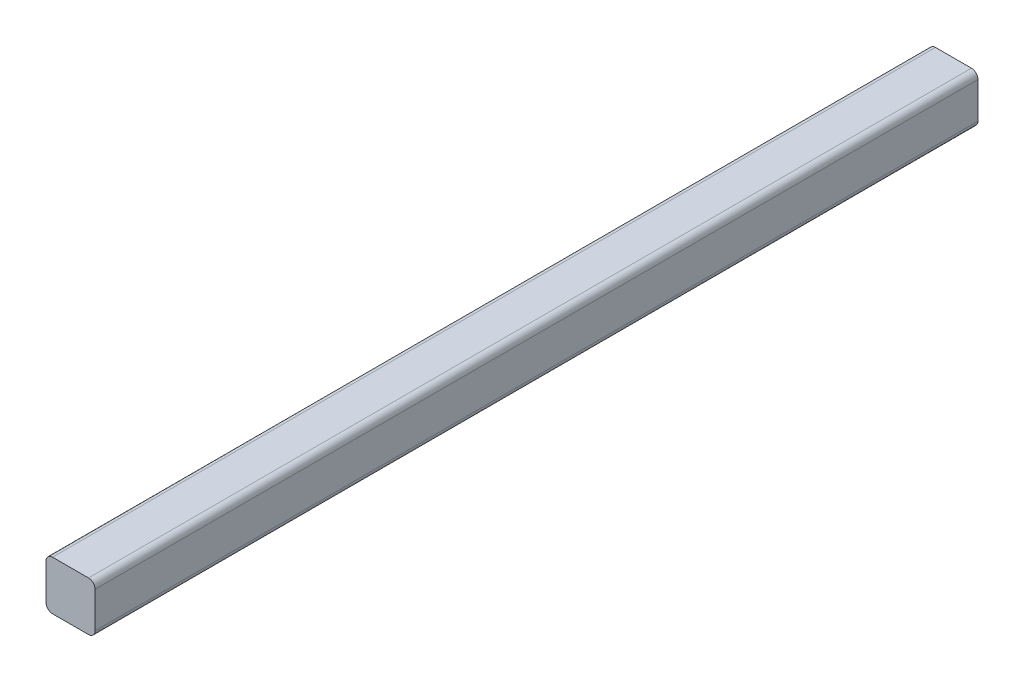
ISO-10303-21;
HEADER;
FILE_DESCRIPTION(('STEP AP214'),'2;1');
FILE_NAME('part.step','',(''),(''),'','','');
FILE_SCHEMA(('AUTOMOTIVE_DESIGN { 1 0 10303 214 1 1 1 1 }'));
ENDSEC;
DATA;
#1=APPLICATION_CONTEXT('core data for automotive mechanical design processes');
#2=APPLICATION_PROTOCOL_DEFINITION('international standard','automotive_design',2000,#1);
#3=PRODUCT_CONTEXT('',#1,'mechanical');
#4=PRODUCT('Part','Part','',(#3));
#5=PRODUCT_RELATED_PRODUCT_CATEGORY('part','',(#4));
#6=PRODUCT_DEFINITION_FORMATION('','',#4);
#7=PRODUCT_DEFINITION_CONTEXT('part definition',#1,'design');
#8=PRODUCT_DEFINITION('design','',#6,#7);
#9=PRODUCT_DEFINITION_SHAPE('','',#8);
#10=(LENGTH_UNIT() NAMED_UNIT(*) SI_UNIT(.MILLI.,.METRE.));
#11=(NAMED_UNIT(*) PLANE_ANGLE_UNIT() SI_UNIT($,.RADIAN.));
#12=(NAMED_UNIT(*) SI_UNIT($,.STERADIAN.) SOLID_ANGLE_UNIT());
#13=UNCERTAINTY_MEASURE_WITH_UNIT(LENGTH_MEASURE(1.E-05),#10,'distance_accuracy_value','');
#14=(GEOMETRIC_REPRESENTATION_CONTEXT(3) GLOBAL_UNCERTAINTY_ASSIGNED_CONTEXT((#13)) GLOBAL_UNIT_ASSIGNED_CONTEXT((#10,
#11,#12)) REPRESENTATION_CONTEXT('',''));
#15=CARTESIAN_POINT('',(0.,0.,0.));
#16=DIRECTION('',(0.,0.,1.));
#17=DIRECTION('',(1.,0.,0.));
#18=AXIS2_PLACEMENT_3D('',#15,#16,#17);
#19=CARTESIAN_POINT('',(9.525,-9.525,171.45));
#20=DIRECTION('',(-1.,0.,0.));
#21=DIRECTION('',(0.,0.,1.));
#22=AXIS2_PLACEMENT_3D('',#19,#20,#21);
#23=PLANE('',#22);
#24=DIRECTION('',(0.,1.,0.));
#25=VECTOR('',#24,1.);
#26=CARTESIAN_POINT('',(9.525,-9.525,-171.45));
#27=LINE('',#26,#25);
#28=CARTESIAN_POINT('',(9.525,-6.985,-171.45));
#29=VERTEX_POINT('',#28);
#30=CARTESIAN_POINT('',(9.525,6.98499999999999,-171.45));
#31=VERTEX_POINT('',#30);
#32=EDGE_CURVE('E126',#29,#31,#27,.T.);
#33=ORIENTED_EDGE('',*,*,#32,.T.);
#34=DIRECTION('',(0.,0.,-1.));
#35=VECTOR('',#34,1.);
#36=CARTESIAN_POINT('',(9.525,6.985,171.45));
#37=LINE('',#36,#35);
#38=CARTESIAN_POINT('',(9.525,6.98499999999999,171.45));
#39=VERTEX_POINT('',#38);
#40=EDGE_CURVE('E104',#31,#39,#37,.F.);
#41=ORIENTED_EDGE('',*,*,#40,.T.);
#42=DIRECTION('',(0.,1.,0.));
#43=VECTOR('',#42,1.);
#44=CARTESIAN_POINT('',(9.525,-9.525,171.45));
#45=LINE('',#44,#43);
#46=CARTESIAN_POINT('',(9.525,-6.985,171.45));
#47=VERTEX_POINT('',#46);
#48=EDGE_CURVE('E135',#47,#39,#45,.T.);
#49=ORIENTED_EDGE('',*,*,#48,.F.);
#50=DIRECTION('',(0.,0.,-1.));
#51=VECTOR('',#50,1.);
#52=CARTESIAN_POINT('',(9.525,-6.985,171.45));
#53=LINE('',#52,#51);
#54=EDGE_CURVE('E109',#47,#29,#53,.T.);
#55=ORIENTED_EDGE('',*,*,#54,.T.);
#56=EDGE_LOOP('',(#33,#41,#49,#55));
#57=FACE_BOUND('',#56,.T.);
#58=ADVANCED_FACE('F33',(#57),#23,.F.);
#59=CARTESIAN_POINT('',(-9.525,9.525,171.45));
#60=DIRECTION('',(0.,-1.,0.));
#61=DIRECTION('',(0.,0.,-1.));
#62=AXIS2_PLACEMENT_3D('',#59,#60,#61);
#63=PLANE('',#62);
#64=DIRECTION('',(-1.,0.,0.));
#65=VECTOR('',#64,1.);
#66=CARTESIAN_POINT('',(-9.525,9.525,171.45));
#67=LINE('',#66,#65);
#68=CARTESIAN_POINT('',(6.98499999999999,9.525,171.45));
#69=VERTEX_POINT('',#68);
#70=CARTESIAN_POINT('',(-6.985,9.525,171.45));
#71=VERTEX_POINT('',#70);
#72=EDGE_CURVE('E119',#69,#71,#67,.T.);
#73=ORIENTED_EDGE('',*,*,#72,.F.);
#74=DIRECTION('',(0.,0.,-1.));
#75=VECTOR('',#74,1.);
#76=CARTESIAN_POINT('',(6.985,9.525,171.45));
#77=LINE('',#76,#75);
#78=CARTESIAN_POINT('',(6.98499999999999,9.525,-171.45));
#79=VERTEX_POINT('',#78);
#80=EDGE_CURVE('E103',#69,#79,#77,.T.);
#81=ORIENTED_EDGE('',*,*,#80,.T.);
#82=DIRECTION('',(-1.,0.,0.));
#83=VECTOR('',#82,1.);
#84=CARTESIAN_POINT('',(-9.525,9.525,-171.45));
#85=LINE('',#84,#83);
#86=CARTESIAN_POINT('',(-6.985,9.525,-171.45));
#87=VERTEX_POINT('',#86);
#88=EDGE_CURVE('E116',#79,#87,#85,.T.);
#89=ORIENTED_EDGE('',*,*,#88,.T.);
#90=DIRECTION('',(0.,0.,-1.));
#91=VECTOR('',#90,1.);
#92=CARTESIAN_POINT('',(-6.985,9.525,171.45));
#93=LINE('',#92,#91);
#94=EDGE_CURVE('E121',#87,#71,#93,.F.);
#95=ORIENTED_EDGE('',*,*,#94,.T.);
#96=EDGE_LOOP('',(#73,#81,#89,#95));
#97=FACE_BOUND('',#96,.T.);
#98=ADVANCED_FACE('F115',(#97),#63,.F.);
#99=CARTESIAN_POINT('',(-9.525,-9.525,171.45));
#100=DIRECTION('',(1.,0.,0.));
#101=DIRECTION('',(0.,0.,-1.));
#102=AXIS2_PLACEMENT_3D('',#99,#100,#101);
#103=PLANE('',#102);
#104=DIRECTION('',(0.,-1.,0.));
#105=VECTOR('',#104,1.);
#106=CARTESIAN_POINT('',(-9.525,-9.525,171.45));
#107=LINE('',#106,#105);
#108=CARTESIAN_POINT('',(-9.525,6.98499999999999,171.45));
#109=VERTEX_POINT('',#108);
#110=CARTESIAN_POINT('',(-9.525,-6.985,171.45));
#111=VERTEX_POINT('',#110);
#112=EDGE_CURVE('E161',#109,#111,#107,.T.);
#113=ORIENTED_EDGE('',*,*,#112,.F.);
#114=DIRECTION('',(0.,0.,-1.));
#115=VECTOR('',#114,1.);
#116=CARTESIAN_POINT('',(-9.525,6.985,171.45));
#117=LINE('',#116,#115);
#118=CARTESIAN_POINT('',(-9.525,6.98499999999999,-171.45));
#119=VERTEX_POINT('',#118);
#120=EDGE_CURVE('E154',#109,#119,#117,.T.);
#121=ORIENTED_EDGE('',*,*,#120,.T.);
#122=DIRECTION('',(0.,-1.,0.));
#123=VECTOR('',#122,1.);
#124=CARTESIAN_POINT('',(-9.525,-9.525,-171.45));
#125=LINE('',#124,#123);
#126=CARTESIAN_POINT('',(-9.525,-6.985,-171.45));
#127=VERTEX_POINT('',#126);
#128=EDGE_CURVE('E125',#119,#127,#125,.T.);
#129=ORIENTED_EDGE('',*,*,#128,.T.);
#130=DIRECTION('',(0.,0.,-1.));
#131=VECTOR('',#130,1.);
#132=CARTESIAN_POINT('',(-9.525,-6.985,171.45));
#133=LINE('',#132,#131);
#134=EDGE_CURVE('E152',#127,#111,#133,.F.);
#135=ORIENTED_EDGE('',*,*,#134,.T.);
#136=EDGE_LOOP('',(#113,#121,#129,#135));
#137=FACE_BOUND('',#136,.T.);
#138=ADVANCED_FACE('F159',(#137),#103,.F.);
#139=CARTESIAN_POINT('',(-9.525,-9.525,171.45));
#140=DIRECTION('',(0.,1.,0.));
#141=DIRECTION('',(0.,0.,1.));
#142=AXIS2_PLACEMENT_3D('',#139,#140,#141);
#143=PLANE('',#142);
#144=DIRECTION('',(1.,0.,0.));
#145=VECTOR('',#144,1.);
#146=CARTESIAN_POINT('',(-9.525,-9.525,171.45));
#147=LINE('',#146,#145);
#148=CARTESIAN_POINT('',(-6.985,-9.525,171.45));
#149=VERTEX_POINT('',#148);
#150=CARTESIAN_POINT('',(6.98499999999999,-9.525,171.45));
#151=VERTEX_POINT('',#150);
#152=EDGE_CURVE('E136',#149,#151,#147,.T.);
#153=ORIENTED_EDGE('',*,*,#152,.F.);
#154=DIRECTION('',(0.,0.,-1.));
#155=VECTOR('',#154,1.);
#156=CARTESIAN_POINT('',(-6.985,-9.525,171.45));
#157=LINE('',#156,#155);
#158=CARTESIAN_POINT('',(-6.985,-9.525,-171.45));
#159=VERTEX_POINT('',#158);
#160=EDGE_CURVE('E11',#149,#159,#157,.T.);
#161=ORIENTED_EDGE('',*,*,#160,.T.);
#162=DIRECTION('',(1.,0.,0.));
#163=VECTOR('',#162,1.);
#164=CARTESIAN_POINT('',(-9.525,-9.525,-171.45));
#165=LINE('',#164,#163);
#166=CARTESIAN_POINT('',(6.98499999999999,-9.525,-171.45));
#167=VERTEX_POINT('',#166);
#168=EDGE_CURVE('E129',#159,#167,#165,.T.);
#169=ORIENTED_EDGE('',*,*,#168,.T.);
#170=DIRECTION('',(0.,0.,-1.));
#171=VECTOR('',#170,1.);
#172=CARTESIAN_POINT('',(6.985,-9.525,171.45));
#173=LINE('',#172,#171);
#174=EDGE_CURVE('E41',#167,#151,#173,.F.);
#175=ORIENTED_EDGE('',*,*,#174,.T.);
#176=EDGE_LOOP('',(#153,#161,#169,#175));
#177=FACE_BOUND('',#176,.T.);
#178=ADVANCED_FACE('F168',(#177),#143,.F.);
#179=CARTESIAN_POINT('',(0.,0.,171.45));
#180=DIRECTION('',(0.,0.,-1.));
#181=DIRECTION('',(-1.,0.,0.));
#182=AXIS2_PLACEMENT_3D('',#179,#180,#181);
#183=PLANE('',#182);
#184=ORIENTED_EDGE('',*,*,#48,.T.);
#185=CARTESIAN_POINT('',(6.985,6.985,171.45));
#186=DIRECTION('',(0.,0.,-1.));
#187=DIRECTION('',(-1.,0.,0.));
#188=AXIS2_PLACEMENT_3D('',#185,#186,#187);
#189=CIRCLE('',#188,2.54);
#190=EDGE_CURVE('E150',#39,#69,#189,.F.);
#191=ORIENTED_EDGE('',*,*,#190,.T.);
#192=ORIENTED_EDGE('',*,*,#72,.T.);
#193=CARTESIAN_POINT('',(-6.985,6.985,171.45));
#194=DIRECTION('',(0.,0.,-1.));
#195=DIRECTION('',(-1.,0.,0.));
#196=AXIS2_PLACEMENT_3D('',#193,#194,#195);
#197=CIRCLE('',#196,2.54);
#198=EDGE_CURVE('E148',#71,#109,#197,.F.);
#199=ORIENTED_EDGE('',*,*,#198,.T.);
#200=ORIENTED_EDGE('',*,*,#112,.T.);
#201=CARTESIAN_POINT('',(-6.985,-6.985,171.45));
#202=DIRECTION('',(0.,0.,-1.));
#203=DIRECTION('',(-1.,0.,0.));
#204=AXIS2_PLACEMENT_3D('',#201,#202,#203);
#205=CIRCLE('',#204,2.54);
#206=EDGE_CURVE('E54',#111,#149,#205,.F.);
#207=ORIENTED_EDGE('',*,*,#206,.T.);
#208=ORIENTED_EDGE('',*,*,#152,.T.);
#209=CARTESIAN_POINT('',(6.985,-6.985,171.45));
#210=DIRECTION('',(0.,0.,-1.));
#211=DIRECTION('',(-1.,0.,0.));
#212=AXIS2_PLACEMENT_3D('',#209,#210,#211);
#213=CIRCLE('',#212,2.54);
#214=EDGE_CURVE('E145',#151,#47,#213,.F.);
#215=ORIENTED_EDGE('',*,*,#214,.T.);
#216=EDGE_LOOP('',(#184,#191,#192,#199,#200,#207,#208,#215));
#217=FACE_BOUND('',#216,.T.);
#218=ADVANCED_FACE('F175',(#217),#183,.F.);
#219=CARTESIAN_POINT('',(0.,0.,-171.45));
#220=DIRECTION('',(0.,0.,-1.));
#221=DIRECTION('',(-1.,0.,0.));
#222=AXIS2_PLACEMENT_3D('',#219,#220,#221);
#223=PLANE('',#222);
#224=ORIENTED_EDGE('',*,*,#88,.F.);
#225=CARTESIAN_POINT('',(6.985,6.985,-171.45));
#226=DIRECTION('',(0.,0.,-1.));
#227=DIRECTION('',(-1.,0.,0.));
#228=AXIS2_PLACEMENT_3D('',#225,#226,#227);
#229=CIRCLE('',#228,2.54);
#230=EDGE_CURVE('E99',#79,#31,#229,.T.);
#231=ORIENTED_EDGE('',*,*,#230,.T.);
#232=ORIENTED_EDGE('',*,*,#32,.F.);
#233=CARTESIAN_POINT('',(6.985,-6.985,-171.45));
#234=DIRECTION('',(0.,0.,-1.));
#235=DIRECTION('',(-1.,0.,0.));
#236=AXIS2_PLACEMENT_3D('',#233,#234,#235);
#237=CIRCLE('',#236,2.54);
#238=EDGE_CURVE('E120',#29,#167,#237,.T.);
#239=ORIENTED_EDGE('',*,*,#238,.T.);
#240=ORIENTED_EDGE('',*,*,#168,.F.);
#241=CARTESIAN_POINT('',(-6.985,-6.985,-171.45));
#242=DIRECTION('',(0.,0.,-1.));
#243=DIRECTION('',(-1.,0.,0.));
#244=AXIS2_PLACEMENT_3D('',#241,#242,#243);
#245=CIRCLE('',#244,2.54);
#246=EDGE_CURVE('E139',#159,#127,#245,.T.);
#247=ORIENTED_EDGE('',*,*,#246,.T.);
#248=ORIENTED_EDGE('',*,*,#128,.F.);
#249=CARTESIAN_POINT('',(-6.985,6.985,-171.45));
#250=DIRECTION('',(0.,0.,-1.));
#251=DIRECTION('',(-1.,0.,0.));
#252=AXIS2_PLACEMENT_3D('',#249,#250,#251);
#253=CIRCLE('',#252,2.54);
#254=EDGE_CURVE('E110',#119,#87,#253,.T.);
#255=ORIENTED_EDGE('',*,*,#254,.T.);
#256=EDGE_LOOP('',(#224,#231,#232,#239,#240,#247,#248,#255));
#257=FACE_BOUND('',#256,.T.);
#258=ADVANCED_FACE('F123',(#257),#223,.T.);
#259=CARTESIAN_POINT('',(6.985,6.985,171.45));
#260=DIRECTION('',(0.,0.,-1.));
#261=DIRECTION('',(-1.,0.,0.));
#262=AXIS2_PLACEMENT_3D('',#259,#260,#261);
#263=CYLINDRICAL_SURFACE('',#262,2.54);
#264=ORIENTED_EDGE('',*,*,#190,.F.);
#265=ORIENTED_EDGE('',*,*,#40,.F.);
#266=ORIENTED_EDGE('',*,*,#230,.F.);
#267=ORIENTED_EDGE('',*,*,#80,.F.);
#268=EDGE_LOOP('',(#264,#265,#266,#267));
#269=FACE_BOUND('',#268,.T.);
#270=ADVANCED_FACE('F102',(#269),#263,.T.);
#271=CARTESIAN_POINT('',(-6.985,6.985,171.45));
#272=DIRECTION('',(0.,0.,-1.));
#273=DIRECTION('',(-1.,0.,0.));
#274=AXIS2_PLACEMENT_3D('',#271,#272,#273);
#275=CYLINDRICAL_SURFACE('',#274,2.54);
#276=ORIENTED_EDGE('',*,*,#198,.F.);
#277=ORIENTED_EDGE('',*,*,#94,.F.);
#278=ORIENTED_EDGE('',*,*,#254,.F.);
#279=ORIENTED_EDGE('',*,*,#120,.F.);
#280=EDGE_LOOP('',(#276,#277,#278,#279));
#281=FACE_BOUND('',#280,.T.);
#282=ADVANCED_FACE('F183',(#281),#275,.T.);
#283=CARTESIAN_POINT('',(-6.985,-6.985,171.45));
#284=DIRECTION('',(0.,0.,-1.));
#285=DIRECTION('',(-1.,0.,0.));
#286=AXIS2_PLACEMENT_3D('',#283,#284,#285);
#287=CYLINDRICAL_SURFACE('',#286,2.54);
#288=ORIENTED_EDGE('',*,*,#206,.F.);
#289=ORIENTED_EDGE('',*,*,#134,.F.);
#290=ORIENTED_EDGE('',*,*,#246,.F.);
#291=ORIENTED_EDGE('',*,*,#160,.F.);
#292=EDGE_LOOP('',(#288,#289,#290,#291));
#293=FACE_BOUND('',#292,.T.);
#294=ADVANCED_FACE('F167',(#293),#287,.T.);
#295=CARTESIAN_POINT('',(6.985,-6.985,171.45));
#296=DIRECTION('',(0.,0.,-1.));
#297=DIRECTION('',(-1.,0.,0.));
#298=AXIS2_PLACEMENT_3D('',#295,#296,#297);
#299=CYLINDRICAL_SURFACE('',#298,2.54);
#300=ORIENTED_EDGE('',*,*,#214,.F.);
#301=ORIENTED_EDGE('',*,*,#174,.F.);
#302=ORIENTED_EDGE('',*,*,#238,.F.);
#303=ORIENTED_EDGE('',*,*,#54,.F.);
#304=EDGE_LOOP('',(#300,#301,#302,#303));
#305=FACE_BOUND('',#304,.T.);
#306=ADVANCED_FACE('F35',(#305),#299,.T.);
#307=CLOSED_SHELL('',(#58,#98,#138,#178,#218,#258,#270,#282,#294,#306));
#308=MANIFOLD_SOLID_BREP('B2',#307);
#309=ADVANCED_BREP_SHAPE_REPRESENTATION('',(#18,#308),#14);
#310=SHAPE_DEFINITION_REPRESENTATION(#9,#309);
ENDSEC;
END-ISO-10303-21;
